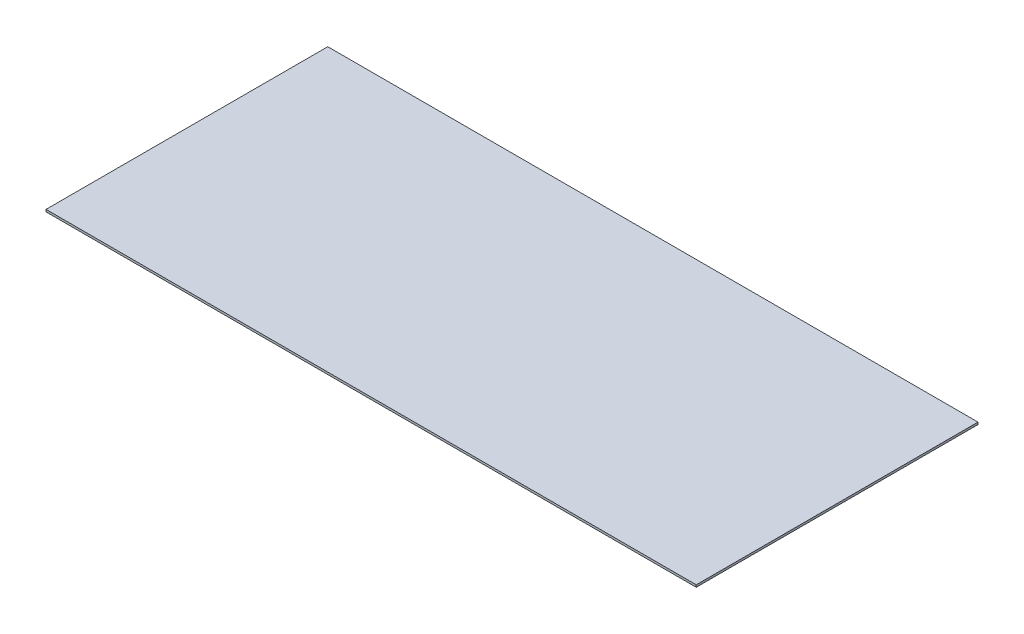
ISO-10303-21;
HEADER;
FILE_DESCRIPTION(('STEP AP214'),'2;1');
FILE_NAME('part.step','',(''),(''),'','','');
FILE_SCHEMA(('AUTOMOTIVE_DESIGN { 1 0 10303 214 1 1 1 1 }'));
ENDSEC;
DATA;
#1=APPLICATION_CONTEXT('core data for automotive mechanical design processes');
#2=APPLICATION_PROTOCOL_DEFINITION('international standard','automotive_design',2000,#1);
#3=PRODUCT_CONTEXT('',#1,'mechanical');
#4=PRODUCT('Part','Part','',(#3));
#5=PRODUCT_RELATED_PRODUCT_CATEGORY('part','',(#4));
#6=PRODUCT_DEFINITION_FORMATION('','',#4);
#7=PRODUCT_DEFINITION_CONTEXT('part definition',#1,'design');
#8=PRODUCT_DEFINITION('design','',#6,#7);
#9=PRODUCT_DEFINITION_SHAPE('','',#8);
#10=(LENGTH_UNIT() NAMED_UNIT(*) SI_UNIT(.MILLI.,.METRE.));
#11=(NAMED_UNIT(*) PLANE_ANGLE_UNIT() SI_UNIT($,.RADIAN.));
#12=(NAMED_UNIT(*) SI_UNIT($,.STERADIAN.) SOLID_ANGLE_UNIT());
#13=UNCERTAINTY_MEASURE_WITH_UNIT(LENGTH_MEASURE(1.E-05),#10,'distance_accuracy_value','');
#14=(GEOMETRIC_REPRESENTATION_CONTEXT(3) GLOBAL_UNCERTAINTY_ASSIGNED_CONTEXT((#13)) GLOBAL_UNIT_ASSIGNED_CONTEXT((#10,
#11,#12)) REPRESENTATION_CONTEXT('',''));
#15=CARTESIAN_POINT('',(0.,0.,0.));
#16=DIRECTION('',(0.,0.,1.));
#17=DIRECTION('',(1.,0.,0.));
#18=AXIS2_PLACEMENT_3D('',#15,#16,#17);
#19=CARTESIAN_POINT('',(-300.,2.,125.));
#20=DIRECTION('',(1.,0.,0.));
#21=DIRECTION('',(0.,0.,-1.));
#22=AXIS2_PLACEMENT_3D('',#19,#20,#21);
#23=PLANE('',#22);
#24=DIRECTION('',(0.,0.,1.));
#25=VECTOR('',#24,1.);
#26=CARTESIAN_POINT('',(-300.,0.,125.));
#27=LINE('',#26,#25);
#28=CARTESIAN_POINT('',(-300.,0.,-135.));
#29=VERTEX_POINT('',#28);
#30=CARTESIAN_POINT('',(-300.,0.,125.));
#31=VERTEX_POINT('',#30);
#32=EDGE_CURVE('E97',#29,#31,#27,.T.);
#33=ORIENTED_EDGE('',*,*,#32,.T.);
#34=DIRECTION('',(0.,-1.,0.));
#35=VECTOR('',#34,1.);
#36=CARTESIAN_POINT('',(-300.,2.,125.));
#37=LINE('',#36,#35);
#38=CARTESIAN_POINT('',(-300.,2.,125.));
#39=VERTEX_POINT('',#38);
#40=EDGE_CURVE('E11',#39,#31,#37,.T.);
#41=ORIENTED_EDGE('',*,*,#40,.F.);
#42=DIRECTION('',(0.,0.,1.));
#43=VECTOR('',#42,1.);
#44=CARTESIAN_POINT('',(-300.,2.,125.));
#45=LINE('',#44,#43);
#46=CARTESIAN_POINT('',(-300.,2.,-135.));
#47=VERTEX_POINT('',#46);
#48=EDGE_CURVE('E85',#47,#39,#45,.T.);
#49=ORIENTED_EDGE('',*,*,#48,.F.);
#50=DIRECTION('',(0.,-1.,0.));
#51=VECTOR('',#50,1.);
#52=CARTESIAN_POINT('',(-300.,2.,-135.));
#53=LINE('',#52,#51);
#54=EDGE_CURVE('E93',#47,#29,#53,.T.);
#55=ORIENTED_EDGE('',*,*,#54,.T.);
#56=EDGE_LOOP('',(#33,#41,#49,#55));
#57=FACE_BOUND('',#56,.T.);
#58=ADVANCED_FACE('F34',(#57),#23,.F.);
#59=CARTESIAN_POINT('',(300.,2.,125.));
#60=DIRECTION('',(0.,0.,-1.));
#61=DIRECTION('',(-1.,0.,0.));
#62=AXIS2_PLACEMENT_3D('',#59,#60,#61);
#63=PLANE('',#62);
#64=DIRECTION('',(1.,0.,0.));
#65=VECTOR('',#64,1.);
#66=CARTESIAN_POINT('',(300.,0.,125.));
#67=LINE('',#66,#65);
#68=CARTESIAN_POINT('',(300.,0.,125.));
#69=VERTEX_POINT('',#68);
#70=EDGE_CURVE('E89',#31,#69,#67,.T.);
#71=ORIENTED_EDGE('',*,*,#70,.T.);
#72=DIRECTION('',(0.,-1.,0.));
#73=VECTOR('',#72,1.);
#74=CARTESIAN_POINT('',(300.,2.,125.));
#75=LINE('',#74,#73);
#76=CARTESIAN_POINT('',(300.,2.,125.));
#77=VERTEX_POINT('',#76);
#78=EDGE_CURVE('E42',#77,#69,#75,.T.);
#79=ORIENTED_EDGE('',*,*,#78,.F.);
#80=DIRECTION('',(1.,0.,0.));
#81=VECTOR('',#80,1.);
#82=CARTESIAN_POINT('',(300.,2.,125.));
#83=LINE('',#82,#81);
#84=EDGE_CURVE('E80',#39,#77,#83,.T.);
#85=ORIENTED_EDGE('',*,*,#84,.F.);
#86=ORIENTED_EDGE('',*,*,#40,.T.);
#87=EDGE_LOOP('',(#71,#79,#85,#86));
#88=FACE_BOUND('',#87,.T.);
#89=ADVANCED_FACE('F88',(#88),#63,.F.);
#90=CARTESIAN_POINT('',(300.,2.,125.));
#91=DIRECTION('',(-1.,0.,0.));
#92=DIRECTION('',(0.,0.,1.));
#93=AXIS2_PLACEMENT_3D('',#90,#91,#92);
#94=PLANE('',#93);
#95=DIRECTION('',(0.,0.,-1.));
#96=VECTOR('',#95,1.);
#97=CARTESIAN_POINT('',(300.,0.,125.));
#98=LINE('',#97,#96);
#99=CARTESIAN_POINT('',(300.,0.,-135.));
#100=VERTEX_POINT('',#99);
#101=EDGE_CURVE('E67',#69,#100,#98,.T.);
#102=ORIENTED_EDGE('',*,*,#101,.T.);
#103=DIRECTION('',(0.,-1.,0.));
#104=VECTOR('',#103,1.);
#105=CARTESIAN_POINT('',(300.,2.,-135.));
#106=LINE('',#105,#104);
#107=CARTESIAN_POINT('',(300.,2.,-135.));
#108=VERTEX_POINT('',#107);
#109=EDGE_CURVE('E90',#108,#100,#106,.T.);
#110=ORIENTED_EDGE('',*,*,#109,.F.);
#111=DIRECTION('',(0.,0.,-1.));
#112=VECTOR('',#111,1.);
#113=CARTESIAN_POINT('',(300.,2.,125.));
#114=LINE('',#113,#112);
#115=EDGE_CURVE('E83',#77,#108,#114,.T.);
#116=ORIENTED_EDGE('',*,*,#115,.F.);
#117=ORIENTED_EDGE('',*,*,#78,.T.);
#118=EDGE_LOOP('',(#102,#110,#116,#117));
#119=FACE_BOUND('',#118,.T.);
#120=ADVANCED_FACE('F91',(#119),#94,.F.);
#121=CARTESIAN_POINT('',(300.,2.,-135.));
#122=DIRECTION('',(0.,0.,1.));
#123=DIRECTION('',(1.,0.,0.));
#124=AXIS2_PLACEMENT_3D('',#121,#122,#123);
#125=PLANE('',#124);
#126=DIRECTION('',(-1.,0.,0.));
#127=VECTOR('',#126,1.);
#128=CARTESIAN_POINT('',(300.,0.,-135.));
#129=LINE('',#128,#127);
#130=EDGE_CURVE('E73',#100,#29,#129,.T.);
#131=ORIENTED_EDGE('',*,*,#130,.T.);
#132=ORIENTED_EDGE('',*,*,#54,.F.);
#133=DIRECTION('',(-1.,0.,0.));
#134=VECTOR('',#133,1.);
#135=CARTESIAN_POINT('',(300.,2.,-135.));
#136=LINE('',#135,#134);
#137=EDGE_CURVE('E50',#108,#47,#136,.T.);
#138=ORIENTED_EDGE('',*,*,#137,.F.);
#139=ORIENTED_EDGE('',*,*,#109,.T.);
#140=EDGE_LOOP('',(#131,#132,#138,#139));
#141=FACE_BOUND('',#140,.T.);
#142=ADVANCED_FACE('F104',(#141),#125,.F.);
#143=CARTESIAN_POINT('',(0.,2.,0.));
#144=DIRECTION('',(0.,1.,0.));
#145=DIRECTION('',(0.,0.,1.));
#146=AXIS2_PLACEMENT_3D('',#143,#144,#145);
#147=PLANE('',#146);
#148=ORIENTED_EDGE('',*,*,#48,.T.);
#149=ORIENTED_EDGE('',*,*,#84,.T.);
#150=ORIENTED_EDGE('',*,*,#115,.T.);
#151=ORIENTED_EDGE('',*,*,#137,.T.);
#152=EDGE_LOOP('',(#148,#149,#150,#151));
#153=FACE_BOUND('',#152,.T.);
#154=ADVANCED_FACE('F81',(#153),#147,.T.);
#155=CARTESIAN_POINT('',(0.,0.,0.));
#156=DIRECTION('',(0.,1.,0.));
#157=DIRECTION('',(0.,0.,1.));
#158=AXIS2_PLACEMENT_3D('',#155,#156,#157);
#159=PLANE('',#158);
#160=ORIENTED_EDGE('',*,*,#32,.F.);
#161=ORIENTED_EDGE('',*,*,#130,.F.);
#162=ORIENTED_EDGE('',*,*,#101,.F.);
#163=ORIENTED_EDGE('',*,*,#70,.F.);
#164=EDGE_LOOP('',(#160,#161,#162,#163));
#165=FACE_BOUND('',#164,.T.);
#166=ADVANCED_FACE('F107',(#165),#159,.F.);
#167=CLOSED_SHELL('',(#58,#89,#120,#142,#154,#166));
#168=MANIFOLD_SOLID_BREP('B2',#167);
#169=ADVANCED_BREP_SHAPE_REPRESENTATION('',(#18,#168),#14);
#170=SHAPE_DEFINITION_REPRESENTATION(#9,#169);
ENDSEC;
END-ISO-10303-21;
